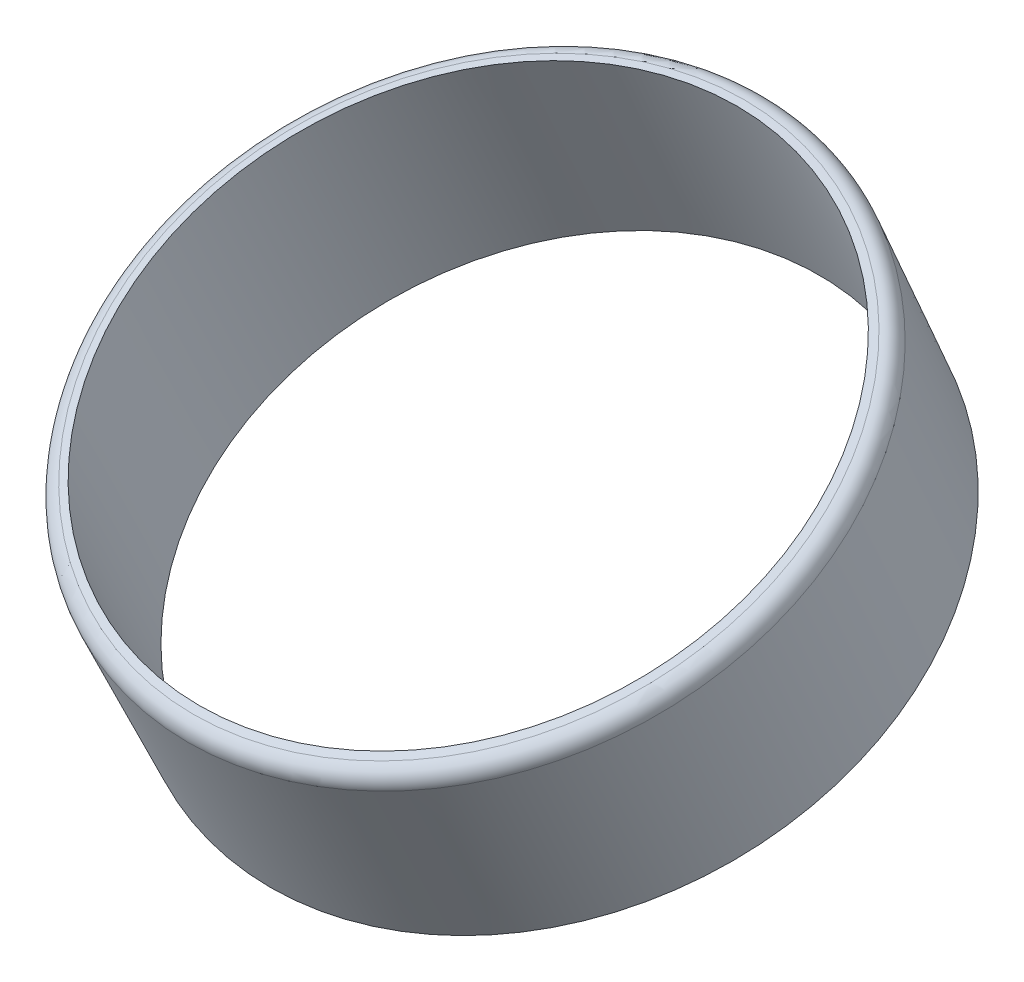
ISO-10303-21;
HEADER;
FILE_DESCRIPTION(('STEP AP214'),'2;1');
FILE_NAME('part.step','',(''),(''),'','','');
FILE_SCHEMA(('AUTOMOTIVE_DESIGN { 1 0 10303 214 1 1 1 1 }'));
ENDSEC;
DATA;
#1=APPLICATION_CONTEXT('core data for automotive mechanical design processes');
#2=APPLICATION_PROTOCOL_DEFINITION('international standard','automotive_design',2000,#1);
#3=PRODUCT_CONTEXT('',#1,'mechanical');
#4=PRODUCT('Part','Part','',(#3));
#5=PRODUCT_RELATED_PRODUCT_CATEGORY('part','',(#4));
#6=PRODUCT_DEFINITION_FORMATION('','',#4);
#7=PRODUCT_DEFINITION_CONTEXT('part definition',#1,'design');
#8=PRODUCT_DEFINITION('design','',#6,#7);
#9=PRODUCT_DEFINITION_SHAPE('','',#8);
#10=(LENGTH_UNIT() NAMED_UNIT(*) SI_UNIT(.MILLI.,.METRE.));
#11=(NAMED_UNIT(*) PLANE_ANGLE_UNIT() SI_UNIT($,.RADIAN.));
#12=(NAMED_UNIT(*) SI_UNIT($,.STERADIAN.) SOLID_ANGLE_UNIT());
#13=UNCERTAINTY_MEASURE_WITH_UNIT(LENGTH_MEASURE(1.E-05),#10,'distance_accuracy_value','');
#14=(GEOMETRIC_REPRESENTATION_CONTEXT(3) GLOBAL_UNCERTAINTY_ASSIGNED_CONTEXT((#13)) GLOBAL_UNIT_ASSIGNED_CONTEXT((#10,
#11,#12)) REPRESENTATION_CONTEXT('',''));
#15=CARTESIAN_POINT('',(0.,0.,0.));
#16=DIRECTION('',(0.,0.,1.));
#17=DIRECTION('',(1.,0.,0.));
#18=AXIS2_PLACEMENT_3D('',#15,#16,#17);
#19=CARTESIAN_POINT('',(0.,33.7347566416583,20.7966424798234));
#20=DIRECTION('',(0.,0.90630778703665,0.4226182617407));
#21=DIRECTION('',(0.,0.4226182617407,-0.90630778703665));
#22=AXIS2_PLACEMENT_3D('',#19,#20,#21);
#23=CONICAL_SURFACE('',#22,7.24957244511609,0.0224681284604766);
#24=CARTESIAN_POINT('',(0.,31.7993938175065,19.894167973613));
#25=DIRECTION('',(0.,-0.90630778703665,-0.4226182617407));
#26=DIRECTION('',(1.,0.,0.));
#27=AXIS2_PLACEMENT_3D('',#24,#25,#26);
#28=CIRCLE('',#27,7.20158510593785);
#29=CARTESIAN_POINT('',(0.,28.7558724382573,26.4210206341316));
#30=VERTEX_POINT('',#29);
#31=EDGE_CURVE('E98',#30,#30,#28,.T.);
#32=ORIENTED_EDGE('',*,*,#31,.F.);
#33=DIRECTION('',(0.,0.896584394458131,0.4428729203893));
#34=VECTOR('',#33,1.);
#35=CARTESIAN_POINT('',(0.,30.67095493654,27.3669864395185));
#36=LINE('',#35,#34);
#37=CARTESIAN_POINT('',(0.,32.5860374348227,28.3129522449053));
#38=VERTEX_POINT('',#37);
#39=EDGE_CURVE('E11',#30,#38,#36,.T.);
#40=ORIENTED_EDGE('',*,*,#39,.T.);
#41=CARTESIAN_POINT('',(0.,35.67011946581,21.6991169860339));
#42=DIRECTION('',(0.,-0.90630778703665,-0.4226182617407));
#43=DIRECTION('',(1.,0.,0.));
#44=AXIS2_PLACEMENT_3D('',#41,#42,#43);
#45=CIRCLE('',#44,7.29755978429435);
#46=CARTESIAN_POINT('',(7.29755978429435,35.67011946581,21.6991169860339));
#47=VERTEX_POINT('',#46);
#48=EDGE_CURVE('E104',#38,#47,#45,.T.);
#49=ORIENTED_EDGE('',*,*,#48,.T.);
#50=CARTESIAN_POINT('',(0.,35.67011946581,21.6991169860339));
#51=DIRECTION('',(0.,-0.90630778703665,-0.4226182617407));
#52=DIRECTION('',(1.,0.,0.));
#53=AXIS2_PLACEMENT_3D('',#50,#51,#52);
#54=CIRCLE('',#53,7.29755978429435);
#55=EDGE_CURVE('E101',#47,#38,#54,.T.);
#56=ORIENTED_EDGE('',*,*,#55,.T.);
#57=ORIENTED_EDGE('',*,*,#39,.F.);
#58=EDGE_LOOP('',(#32,#40,#49,#56,#57));
#59=FACE_BOUND('',#58,.T.);
#60=ADVANCED_FACE('F42',(#59),#23,.T.);
#61=CARTESIAN_POINT('',(0.,35.6782639964339,21.7029148430359));
#62=DIRECTION('',(0.,-0.90630778703665,-0.4226182617407));
#63=DIRECTION('',(-1.,0.,0.));
#64=AXIS2_PLACEMENT_3D('',#61,#62,#63);
#65=TOROIDAL_SURFACE('',#64,6.89766074340639,0.4);
#66=ORIENTED_EDGE('',*,*,#48,.F.);
#67=ORIENTED_EDGE('',*,*,#55,.F.);
#68=CARTESIAN_POINT('',(6.89766074340639,35.6782639964339,21.7029148430359));
#69=DIRECTION('',(0.,-0.4226182617407,0.90630778703665));
#70=DIRECTION('',(1.,0.,0.));
#71=AXIS2_PLACEMENT_3D('',#68,#69,#70);
#72=CIRCLE('',#71,0.4);
#73=CARTESIAN_POINT('',(6.97760868873675,36.0334722837521,21.8685511876525));
#74=VERTEX_POINT('',#73);
#75=EDGE_CURVE('E51',#47,#74,#72,.T.);
#76=ORIENTED_EDGE('',*,*,#75,.T.);
#77=CARTESIAN_POINT('',(0.,36.0334722837521,21.8685511876525));
#78=DIRECTION('',(0.,-0.90630778703665,-0.4226182617407));
#79=DIRECTION('',(1.,0.,0.));
#80=AXIS2_PLACEMENT_3D('',#77,#78,#79);
#81=CIRCLE('',#80,6.97760868873675);
#82=CARTESIAN_POINT('',(-6.97760868873675,36.0334722837521,21.8685511876525));
#83=VERTEX_POINT('',#82);
#84=EDGE_CURVE('E45',#74,#83,#81,.T.);
#85=ORIENTED_EDGE('',*,*,#84,.T.);
#86=CARTESIAN_POINT('',(0.,36.0334722837521,21.8685511876525));
#87=DIRECTION('',(0.,-0.90630778703665,-0.4226182617407));
#88=DIRECTION('',(1.,0.,0.));
#89=AXIS2_PLACEMENT_3D('',#86,#87,#88);
#90=CIRCLE('',#89,6.97760868873675);
#91=EDGE_CURVE('E86',#83,#74,#90,.T.);
#92=ORIENTED_EDGE('',*,*,#91,.T.);
#93=ORIENTED_EDGE('',*,*,#75,.F.);
#94=EDGE_LOOP('',(#66,#67,#76,#85,#92,#93));
#95=FACE_BOUND('',#94,.T.);
#96=ADVANCED_FACE('F109',(#95),#65,.T.);
#97=CARTESIAN_POINT('',(0.,5.03199473906812,7.41232479444609));
#98=DIRECTION('',(0.,0.90630778703665,0.4226182617407));
#99=DIRECTION('',(1.,0.,0.));
#100=AXIS2_PLACEMENT_3D('',#97,#98,#99);
#101=SPHERICAL_SURFACE('',#100,34.9107592942107);
#102=CARTESIAN_POINT('',(0.,36.06457357088,21.8830539560187));
#103=DIRECTION('',(0.,-0.90630778703665,-0.4226182617407));
#104=DIRECTION('',(1.,0.,0.));
#105=AXIS2_PLACEMENT_3D('',#102,#103,#104);
#106=CIRCLE('',#105,6.8072140467383);
#107=CARTESIAN_POINT('',(-6.8072140467383,36.06457357088,21.8830539560187));
#108=VERTEX_POINT('',#107);
#109=CARTESIAN_POINT('',(0.,33.1877206031506,28.0524850546029));
#110=VERTEX_POINT('',#109);
#111=EDGE_CURVE('E83',#108,#110,#106,.T.);
#112=ORIENTED_EDGE('',*,*,#111,.T.);
#113=CARTESIAN_POINT('',(0.,36.06457357088,21.8830539560187));
#114=DIRECTION('',(0.,-0.90630778703665,-0.4226182617407));
#115=DIRECTION('',(1.,0.,0.));
#116=AXIS2_PLACEMENT_3D('',#113,#114,#115);
#117=CIRCLE('',#116,6.8072140467383);
#118=EDGE_CURVE('E88',#110,#108,#117,.T.);
#119=ORIENTED_EDGE('',*,*,#118,.T.);
#120=CARTESIAN_POINT('',(0.,5.03199473906812,7.41232479444609));
#121=DIRECTION('',(0.,-0.4226182617407,0.90630778703665));
#122=DIRECTION('',(-1.,0.,0.));
#123=AXIS2_PLACEMENT_3D('',#120,#121,#122);
#124=CIRCLE('',#123,34.9107592942107);
#125=EDGE_CURVE('E79',#108,#83,#124,.T.);
#126=ORIENTED_EDGE('',*,*,#125,.T.);
#127=ORIENTED_EDGE('',*,*,#84,.F.);
#128=ORIENTED_EDGE('',*,*,#91,.F.);
#129=ORIENTED_EDGE('',*,*,#125,.F.);
#130=EDGE_LOOP('',(#112,#119,#126,#127,#128,#129));
#131=FACE_BOUND('',#130,.T.);
#132=ADVANCED_FACE('F81',(#131),#101,.T.);
#133=CARTESIAN_POINT('',(0.,33.9319836941932,20.8886109648158));
#134=DIRECTION('',(0.,0.90630778703665,0.4226182617407));
#135=DIRECTION('',(0.,0.4226182617407,-0.90630778703665));
#136=AXIS2_PLACEMENT_3D('',#133,#134,#135);
#137=CONICAL_SURFACE('',#136,6.75433646096287,0.0224681284604717);
#138=CARTESIAN_POINT('',(0.,31.7993938175065,19.894167973613));
#139=DIRECTION('',(0.,-0.90630778703665,-0.4226182617407));
#140=DIRECTION('',(1.,0.,0.));
#141=AXIS2_PLACEMENT_3D('',#138,#139,#140);
#142=CIRCLE('',#141,6.70145887518744);
#143=CARTESIAN_POINT('',(0.,28.967234916548,25.9677523367012));
#144=VERTEX_POINT('',#143);
#145=EDGE_CURVE('E95',#144,#144,#142,.T.);
#146=ORIENTED_EDGE('',*,*,#145,.T.);
#147=DIRECTION('',(0.,0.896584394458132,0.442872920389297));
#148=VECTOR('',#147,1.);
#149=CARTESIAN_POINT('',(0.,31.0774777598493,27.010118695652));
#150=LINE('',#149,#148);
#151=EDGE_CURVE('E93',#144,#110,#150,.T.);
#152=ORIENTED_EDGE('',*,*,#151,.T.);
#153=ORIENTED_EDGE('',*,*,#111,.F.);
#154=ORIENTED_EDGE('',*,*,#118,.F.);
#155=ORIENTED_EDGE('',*,*,#151,.F.);
#156=EDGE_LOOP('',(#146,#152,#153,#154,#155));
#157=FACE_BOUND('',#156,.T.);
#158=ADVANCED_FACE('F92',(#157),#137,.F.);
#159=CARTESIAN_POINT('',(0.,34.631552718465,13.8205836105247));
#160=DIRECTION('',(0.,-0.90630778703665,-0.4226182617407));
#161=DIRECTION('',(0.,0.4226182617407,-0.90630778703665));
#162=AXIS2_PLACEMENT_3D('',#159,#160,#161);
#163=PLANE('',#162);
#164=ORIENTED_EDGE('',*,*,#145,.F.);
#165=EDGE_LOOP('',(#164));
#166=FACE_BOUND('',#165,.T.);
#167=ORIENTED_EDGE('',*,*,#31,.T.);
#168=EDGE_LOOP('',(#167));
#169=FACE_BOUND('',#168,.T.);
#170=ADVANCED_FACE('F113',(#166,#169),#163,.T.);
#171=CLOSED_SHELL('',(#60,#96,#132,#158,#170));
#172=MANIFOLD_SOLID_BREP('B2',#171);
#173=ADVANCED_BREP_SHAPE_REPRESENTATION('',(#18,#172),#14);
#174=SHAPE_DEFINITION_REPRESENTATION(#9,#173);
ENDSEC;
END-ISO-10303-21;
